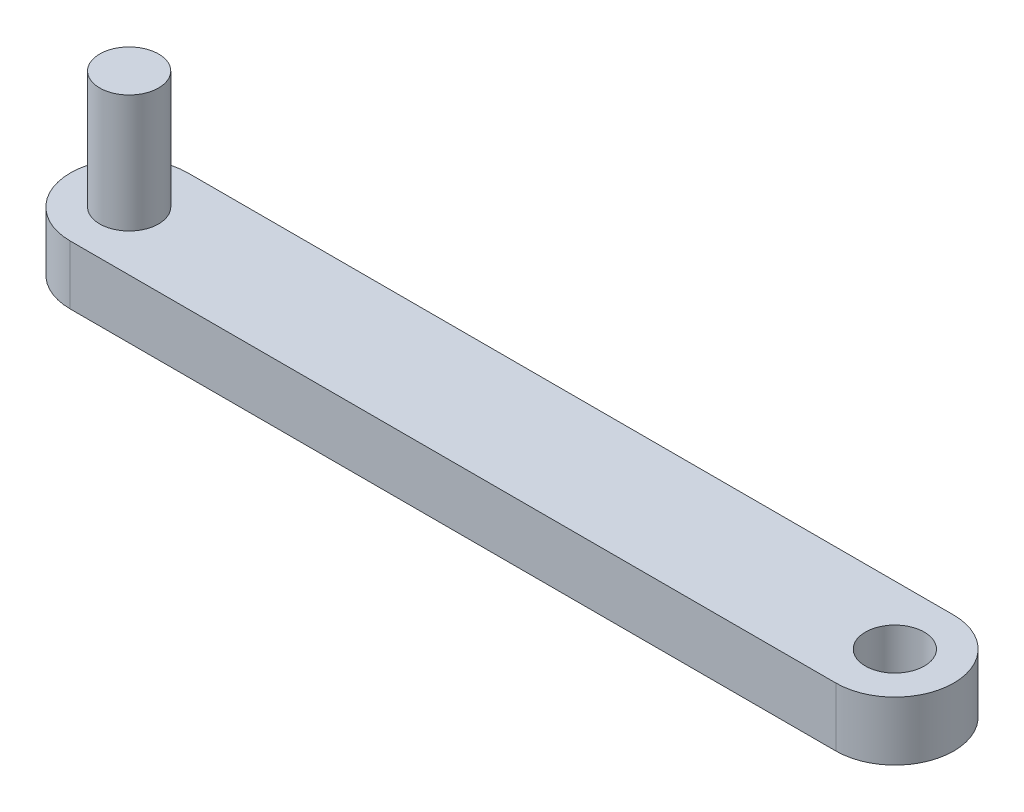
ISO-10303-21;
HEADER;
FILE_DESCRIPTION(('STEP AP214'),'2;1');
FILE_NAME('part.step','',(''),(''),'','','');
FILE_SCHEMA(('AUTOMOTIVE_DESIGN { 1 0 10303 214 1 1 1 1 }'));
ENDSEC;
DATA;
#1=APPLICATION_CONTEXT('core data for automotive mechanical design processes');
#2=APPLICATION_PROTOCOL_DEFINITION('international standard','automotive_design',2000,#1);
#3=PRODUCT_CONTEXT('',#1,'mechanical');
#4=PRODUCT('Part','Part','',(#3));
#5=PRODUCT_RELATED_PRODUCT_CATEGORY('part','',(#4));
#6=PRODUCT_DEFINITION_FORMATION('','',#4);
#7=PRODUCT_DEFINITION_CONTEXT('part definition',#1,'design');
#8=PRODUCT_DEFINITION('design','',#6,#7);
#9=PRODUCT_DEFINITION_SHAPE('','',#8);
#10=(LENGTH_UNIT() NAMED_UNIT(*) SI_UNIT(.MILLI.,.METRE.));
#11=(NAMED_UNIT(*) PLANE_ANGLE_UNIT() SI_UNIT($,.RADIAN.));
#12=(NAMED_UNIT(*) SI_UNIT($,.STERADIAN.) SOLID_ANGLE_UNIT());
#13=UNCERTAINTY_MEASURE_WITH_UNIT(LENGTH_MEASURE(1.E-05),#10,'distance_accuracy_value','');
#14=(GEOMETRIC_REPRESENTATION_CONTEXT(3) GLOBAL_UNCERTAINTY_ASSIGNED_CONTEXT((#13)) GLOBAL_UNIT_ASSIGNED_CONTEXT((#10,
#11,#12)) REPRESENTATION_CONTEXT('',''));
#15=CARTESIAN_POINT('',(0.,0.,0.));
#16=DIRECTION('',(0.,0.,1.));
#17=DIRECTION('',(1.,0.,0.));
#18=AXIS2_PLACEMENT_3D('',#15,#16,#17);
#19=CARTESIAN_POINT('',(65.,5.,0.));
#20=DIRECTION('',(0.,1.,0.));
#21=DIRECTION('',(0.,0.,1.));
#22=AXIS2_PLACEMENT_3D('',#19,#20,#21);
#23=PLANE('',#22);
#24=CARTESIAN_POINT('',(-65.,5.,0.));
#25=DIRECTION('',(0.,1.,0.));
#26=DIRECTION('',(0.,0.,1.));
#27=AXIS2_PLACEMENT_3D('',#24,#25,#26);
#28=CIRCLE('',#27,5.);
#29=CARTESIAN_POINT('',(-65.,5.,5.));
#30=VERTEX_POINT('',#29);
#31=EDGE_CURVE('E112',#30,#30,#28,.T.);
#32=ORIENTED_EDGE('',*,*,#31,.F.);
#33=EDGE_LOOP('',(#32));
#34=FACE_BOUND('',#33,.T.);
#35=CARTESIAN_POINT('',(65.,5.,0.));
#36=DIRECTION('',(0.,1.,0.));
#37=DIRECTION('',(0.,0.,1.));
#38=AXIS2_PLACEMENT_3D('',#35,#36,#37);
#39=CIRCLE('',#38,10.);
#40=CARTESIAN_POINT('',(65.,5.,10.));
#41=VERTEX_POINT('',#40);
#42=CARTESIAN_POINT('',(65.,5.,-10.));
#43=VERTEX_POINT('',#42);
#44=EDGE_CURVE('E92',#41,#43,#39,.T.);
#45=ORIENTED_EDGE('',*,*,#44,.T.);
#46=DIRECTION('',(-1.,0.,0.));
#47=VECTOR('',#46,1.);
#48=CARTESIAN_POINT('',(-65.,5.,-9.99999999999999));
#49=LINE('',#48,#47);
#50=CARTESIAN_POINT('',(-65.,5.,-9.99999999999999));
#51=VERTEX_POINT('',#50);
#52=EDGE_CURVE('E87',#43,#51,#49,.T.);
#53=ORIENTED_EDGE('',*,*,#52,.T.);
#54=CARTESIAN_POINT('',(-65.,5.,0.));
#55=DIRECTION('',(0.,1.,0.));
#56=DIRECTION('',(0.,0.,-1.));
#57=AXIS2_PLACEMENT_3D('',#54,#55,#56);
#58=CIRCLE('',#57,10.);
#59=CARTESIAN_POINT('',(-65.,5.,10.));
#60=VERTEX_POINT('',#59);
#61=EDGE_CURVE('E90',#51,#60,#58,.T.);
#62=ORIENTED_EDGE('',*,*,#61,.T.);
#63=DIRECTION('',(1.,0.,0.));
#64=VECTOR('',#63,1.);
#65=CARTESIAN_POINT('',(-65.,5.,10.));
#66=LINE('',#65,#64);
#67=EDGE_CURVE('E57',#60,#41,#66,.T.);
#68=ORIENTED_EDGE('',*,*,#67,.T.);
#69=EDGE_LOOP('',(#45,#53,#62,#68));
#70=FACE_BOUND('',#69,.T.);
#71=CARTESIAN_POINT('',(65.,5.,0.));
#72=DIRECTION('',(0.,1.,0.));
#73=DIRECTION('',(0.,0.,1.));
#74=AXIS2_PLACEMENT_3D('',#71,#72,#73);
#75=CIRCLE('',#74,5.);
#76=CARTESIAN_POINT('',(65.,5.,5.00000000000001));
#77=VERTEX_POINT('',#76);
#78=EDGE_CURVE('E133',#77,#77,#75,.T.);
#79=ORIENTED_EDGE('',*,*,#78,.F.);
#80=EDGE_LOOP('',(#79));
#81=FACE_BOUND('',#80,.T.);
#82=ADVANCED_FACE('F39',(#34,#70,#81),#23,.T.);
#83=CARTESIAN_POINT('',(65.,-5.,0.));
#84=DIRECTION('',(0.,1.,0.));
#85=DIRECTION('',(0.,0.,1.));
#86=AXIS2_PLACEMENT_3D('',#83,#84,#85);
#87=PLANE('',#86);
#88=CARTESIAN_POINT('',(65.,-5.,0.));
#89=DIRECTION('',(0.,1.,0.));
#90=DIRECTION('',(0.,0.,1.));
#91=AXIS2_PLACEMENT_3D('',#88,#89,#90);
#92=CIRCLE('',#91,10.);
#93=CARTESIAN_POINT('',(65.,-5.,10.));
#94=VERTEX_POINT('',#93);
#95=CARTESIAN_POINT('',(65.,-5.,-10.));
#96=VERTEX_POINT('',#95);
#97=EDGE_CURVE('E108',#94,#96,#92,.T.);
#98=ORIENTED_EDGE('',*,*,#97,.F.);
#99=DIRECTION('',(1.,0.,0.));
#100=VECTOR('',#99,1.);
#101=CARTESIAN_POINT('',(-65.,-5.,10.));
#102=LINE('',#101,#100);
#103=CARTESIAN_POINT('',(-65.,-5.,10.));
#104=VERTEX_POINT('',#103);
#105=EDGE_CURVE('E80',#104,#94,#102,.T.);
#106=ORIENTED_EDGE('',*,*,#105,.F.);
#107=CARTESIAN_POINT('',(-65.,-5.,0.));
#108=DIRECTION('',(0.,1.,0.));
#109=DIRECTION('',(0.,0.,-1.));
#110=AXIS2_PLACEMENT_3D('',#107,#108,#109);
#111=CIRCLE('',#110,10.);
#112=CARTESIAN_POINT('',(-65.,-5.,-9.99999999999999));
#113=VERTEX_POINT('',#112);
#114=EDGE_CURVE('E74',#113,#104,#111,.T.);
#115=ORIENTED_EDGE('',*,*,#114,.F.);
#116=DIRECTION('',(-1.,0.,0.));
#117=VECTOR('',#116,1.);
#118=CARTESIAN_POINT('',(-65.,-5.,-9.99999999999999));
#119=LINE('',#118,#117);
#120=EDGE_CURVE('E97',#96,#113,#119,.T.);
#121=ORIENTED_EDGE('',*,*,#120,.F.);
#122=EDGE_LOOP('',(#98,#106,#115,#121));
#123=FACE_BOUND('',#122,.T.);
#124=CARTESIAN_POINT('',(65.,-5.,0.));
#125=DIRECTION('',(0.,1.,0.));
#126=DIRECTION('',(0.,0.,1.));
#127=AXIS2_PLACEMENT_3D('',#124,#125,#126);
#128=CIRCLE('',#127,5.);
#129=CARTESIAN_POINT('',(65.,-5.,5.00000000000001));
#130=VERTEX_POINT('',#129);
#131=EDGE_CURVE('E134',#130,#130,#128,.T.);
#132=ORIENTED_EDGE('',*,*,#131,.T.);
#133=EDGE_LOOP('',(#132));
#134=FACE_BOUND('',#133,.T.);
#135=ADVANCED_FACE('F125',(#123,#134),#87,.F.);
#136=CARTESIAN_POINT('',(65.,5.,0.));
#137=DIRECTION('',(0.,-1.,0.));
#138=DIRECTION('',(0.,0.,-1.));
#139=AXIS2_PLACEMENT_3D('',#136,#137,#138);
#140=CYLINDRICAL_SURFACE('',#139,10.);
#141=ORIENTED_EDGE('',*,*,#97,.T.);
#142=DIRECTION('',(0.,-1.,0.));
#143=VECTOR('',#142,1.);
#144=CARTESIAN_POINT('',(65.,5.,-10.));
#145=LINE('',#144,#143);
#146=EDGE_CURVE('E11',#43,#96,#145,.T.);
#147=ORIENTED_EDGE('',*,*,#146,.F.);
#148=ORIENTED_EDGE('',*,*,#44,.F.);
#149=DIRECTION('',(0.,-1.,0.));
#150=VECTOR('',#149,1.);
#151=CARTESIAN_POINT('',(65.,5.,10.));
#152=LINE('',#151,#150);
#153=EDGE_CURVE('E104',#41,#94,#152,.T.);
#154=ORIENTED_EDGE('',*,*,#153,.T.);
#155=EDGE_LOOP('',(#141,#147,#148,#154));
#156=FACE_BOUND('',#155,.T.);
#157=ADVANCED_FACE('F41',(#156),#140,.T.);
#158=CARTESIAN_POINT('',(-65.,5.,-9.99999999999999));
#159=DIRECTION('',(0.,0.,1.));
#160=DIRECTION('',(1.,0.,0.));
#161=AXIS2_PLACEMENT_3D('',#158,#159,#160);
#162=PLANE('',#161);
#163=ORIENTED_EDGE('',*,*,#120,.T.);
#164=DIRECTION('',(0.,-1.,0.));
#165=VECTOR('',#164,1.);
#166=CARTESIAN_POINT('',(-65.,5.,-9.99999999999999));
#167=LINE('',#166,#165);
#168=EDGE_CURVE('E49',#51,#113,#167,.T.);
#169=ORIENTED_EDGE('',*,*,#168,.F.);
#170=ORIENTED_EDGE('',*,*,#52,.F.);
#171=ORIENTED_EDGE('',*,*,#146,.T.);
#172=EDGE_LOOP('',(#163,#169,#170,#171));
#173=FACE_BOUND('',#172,.T.);
#174=ADVANCED_FACE('F96',(#173),#162,.F.);
#175=CARTESIAN_POINT('',(-65.,5.,0.));
#176=DIRECTION('',(0.,-1.,0.));
#177=DIRECTION('',(0.,0.,-1.));
#178=AXIS2_PLACEMENT_3D('',#175,#176,#177);
#179=CYLINDRICAL_SURFACE('',#178,10.);
#180=ORIENTED_EDGE('',*,*,#114,.T.);
#181=DIRECTION('',(0.,-1.,0.));
#182=VECTOR('',#181,1.);
#183=CARTESIAN_POINT('',(-65.,5.,10.));
#184=LINE('',#183,#182);
#185=EDGE_CURVE('E99',#60,#104,#184,.T.);
#186=ORIENTED_EDGE('',*,*,#185,.F.);
#187=ORIENTED_EDGE('',*,*,#61,.F.);
#188=ORIENTED_EDGE('',*,*,#168,.T.);
#189=EDGE_LOOP('',(#180,#186,#187,#188));
#190=FACE_BOUND('',#189,.T.);
#191=ADVANCED_FACE('F100',(#190),#179,.T.);
#192=CARTESIAN_POINT('',(-65.,5.,10.));
#193=DIRECTION('',(0.,0.,-1.));
#194=DIRECTION('',(-1.,0.,0.));
#195=AXIS2_PLACEMENT_3D('',#192,#193,#194);
#196=PLANE('',#195);
#197=ORIENTED_EDGE('',*,*,#105,.T.);
#198=ORIENTED_EDGE('',*,*,#153,.F.);
#199=ORIENTED_EDGE('',*,*,#67,.F.);
#200=ORIENTED_EDGE('',*,*,#185,.T.);
#201=EDGE_LOOP('',(#197,#198,#199,#200));
#202=FACE_BOUND('',#201,.T.);
#203=ADVANCED_FACE('F122',(#202),#196,.F.);
#204=CARTESIAN_POINT('',(65.,5.,0.));
#205=DIRECTION('',(0.,-1.,0.));
#206=DIRECTION('',(0.,0.,-1.));
#207=AXIS2_PLACEMENT_3D('',#204,#205,#206);
#208=CYLINDRICAL_SURFACE('',#207,5.);
#209=ORIENTED_EDGE('',*,*,#78,.T.);
#210=EDGE_LOOP('',(#209));
#211=FACE_BOUND('',#210,.T.);
#212=ORIENTED_EDGE('',*,*,#131,.F.);
#213=EDGE_LOOP('',(#212));
#214=FACE_BOUND('',#213,.T.);
#215=ADVANCED_FACE('F150',(#211,#214),#208,.F.);
#216=CARTESIAN_POINT('',(-65.,-5.,0.));
#217=DIRECTION('',(0.,1.,0.));
#218=DIRECTION('',(0.,0.,1.));
#219=AXIS2_PLACEMENT_3D('',#216,#217,#218);
#220=CYLINDRICAL_SURFACE('',#219,5.);
#221=ORIENTED_EDGE('',*,*,#31,.T.);
#222=EDGE_LOOP('',(#221));
#223=FACE_BOUND('',#222,.T.);
#224=CARTESIAN_POINT('',(-65.,25.,0.));
#225=DIRECTION('',(0.,1.,0.));
#226=DIRECTION('',(0.,0.,1.));
#227=AXIS2_PLACEMENT_3D('',#224,#225,#226);
#228=CIRCLE('',#227,5.);
#229=CARTESIAN_POINT('',(-65.,25.,5.00000000000001));
#230=VERTEX_POINT('',#229);
#231=EDGE_CURVE('E138',#230,#230,#228,.T.);
#232=ORIENTED_EDGE('',*,*,#231,.F.);
#233=EDGE_LOOP('',(#232));
#234=FACE_BOUND('',#233,.T.);
#235=ADVANCED_FACE('F148',(#223,#234),#220,.T.);
#236=CARTESIAN_POINT('',(-65.,25.,0.));
#237=DIRECTION('',(0.,1.,0.));
#238=DIRECTION('',(0.,0.,1.));
#239=AXIS2_PLACEMENT_3D('',#236,#237,#238);
#240=PLANE('',#239);
#241=ORIENTED_EDGE('',*,*,#231,.T.);
#242=EDGE_LOOP('',(#241));
#243=FACE_BOUND('',#242,.T.);
#244=ADVANCED_FACE('F146',(#243),#240,.T.);
#245=CLOSED_SHELL('',(#82,#135,#157,#174,#191,#203,#215,#235,#244));
#246=MANIFOLD_SOLID_BREP('B2',#245);
#247=ADVANCED_BREP_SHAPE_REPRESENTATION('',(#18,#246),#14);
#248=SHAPE_DEFINITION_REPRESENTATION(#9,#247);
ENDSEC;
END-ISO-10303-21;
